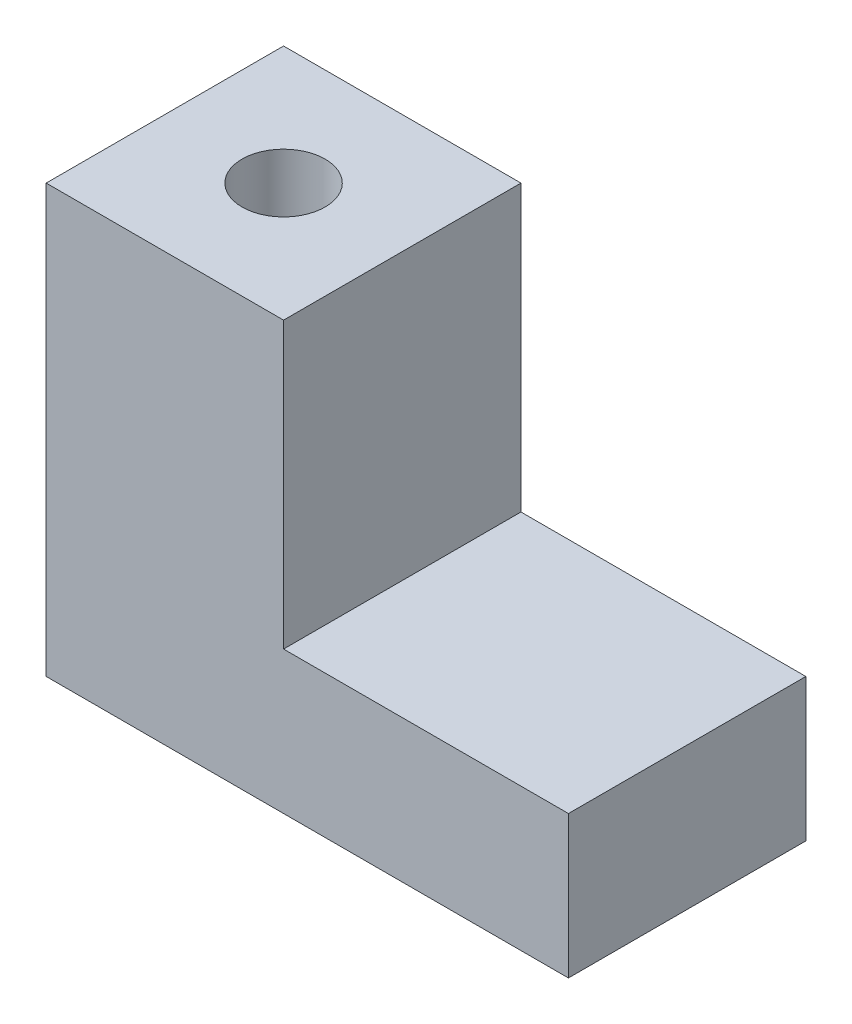
ISO-10303-21;
HEADER;
FILE_DESCRIPTION(('STEP AP214'),'2;1');
FILE_NAME('part.step','',(''),(''),'','','');
FILE_SCHEMA(('AUTOMOTIVE_DESIGN { 1 0 10303 214 1 1 1 1 }'));
ENDSEC;
DATA;
#1=APPLICATION_CONTEXT('core data for automotive mechanical design processes');
#2=APPLICATION_PROTOCOL_DEFINITION('international standard','automotive_design',2000,#1);
#3=PRODUCT_CONTEXT('',#1,'mechanical');
#4=PRODUCT('Part','Part','',(#3));
#5=PRODUCT_RELATED_PRODUCT_CATEGORY('part','',(#4));
#6=PRODUCT_DEFINITION_FORMATION('','',#4);
#7=PRODUCT_DEFINITION_CONTEXT('part definition',#1,'design');
#8=PRODUCT_DEFINITION('design','',#6,#7);
#9=PRODUCT_DEFINITION_SHAPE('','',#8);
#10=(LENGTH_UNIT() NAMED_UNIT(*) SI_UNIT(.MILLI.,.METRE.));
#11=(NAMED_UNIT(*) PLANE_ANGLE_UNIT() SI_UNIT($,.RADIAN.));
#12=(NAMED_UNIT(*) SI_UNIT($,.STERADIAN.) SOLID_ANGLE_UNIT());
#13=UNCERTAINTY_MEASURE_WITH_UNIT(LENGTH_MEASURE(1.E-05),#10,'distance_accuracy_value','');
#14=(GEOMETRIC_REPRESENTATION_CONTEXT(3) GLOBAL_UNCERTAINTY_ASSIGNED_CONTEXT((#13)) GLOBAL_UNIT_ASSIGNED_CONTEXT((#10,
#11,#12)) REPRESENTATION_CONTEXT('',''));
#15=CARTESIAN_POINT('',(0.,0.,0.));
#16=DIRECTION('',(0.,0.,1.));
#17=DIRECTION('',(1.,0.,0.));
#18=AXIS2_PLACEMENT_3D('',#15,#16,#17);
#19=CARTESIAN_POINT('',(5.,0.,-5.));
#20=DIRECTION('',(0.,1.,0.));
#21=DIRECTION('',(0.,0.,1.));
#22=AXIS2_PLACEMENT_3D('',#19,#20,#21);
#23=CYLINDRICAL_SURFACE('',#22,1.75);
#24=CARTESIAN_POINT('',(5.,18.,-5.));
#25=DIRECTION('',(0.,1.,0.));
#26=DIRECTION('',(0.,0.,1.));
#27=AXIS2_PLACEMENT_3D('',#24,#25,#26);
#28=CIRCLE('',#27,1.75);
#29=CARTESIAN_POINT('',(5.,18.,-3.25));
#30=VERTEX_POINT('',#29);
#31=EDGE_CURVE('E178',#30,#30,#28,.T.);
#32=ORIENTED_EDGE('',*,*,#31,.T.);
#33=EDGE_LOOP('',(#32));
#34=FACE_BOUND('',#33,.T.);
#35=CARTESIAN_POINT('',(5.,3.,-5.));
#36=DIRECTION('',(0.,-1.,0.));
#37=DIRECTION('',(0.,0.,-1.));
#38=AXIS2_PLACEMENT_3D('',#35,#36,#37);
#39=CIRCLE('',#38,1.75);
#40=CARTESIAN_POINT('',(5.,3.,-6.75));
#41=VERTEX_POINT('',#40);
#42=EDGE_CURVE('E37',#41,#41,#39,.F.);
#43=ORIENTED_EDGE('',*,*,#42,.F.);
#44=EDGE_LOOP('',(#43));
#45=FACE_BOUND('',#44,.T.);
#46=ADVANCED_FACE('F33',(#34,#45),#23,.F.);
#47=CARTESIAN_POINT('',(0.,6.,0.));
#48=DIRECTION('',(0.,-1.,0.));
#49=DIRECTION('',(0.,0.,-1.));
#50=AXIS2_PLACEMENT_3D('',#47,#48,#49);
#51=PLANE('',#50);
#52=DIRECTION('',(0.,0.,-1.));
#53=VECTOR('',#52,1.);
#54=CARTESIAN_POINT('',(10.,6.,-10.));
#55=LINE('',#54,#53);
#56=CARTESIAN_POINT('',(10.,6.,0.));
#57=VERTEX_POINT('',#56);
#58=CARTESIAN_POINT('',(10.,6.,-10.));
#59=VERTEX_POINT('',#58);
#60=EDGE_CURVE('E57',#57,#59,#55,.T.);
#61=ORIENTED_EDGE('',*,*,#60,.F.);
#62=DIRECTION('',(1.,0.,0.));
#63=VECTOR('',#62,1.);
#64=CARTESIAN_POINT('',(22.,6.,0.));
#65=LINE('',#64,#63);
#66=CARTESIAN_POINT('',(22.,6.,0.));
#67=VERTEX_POINT('',#66);
#68=EDGE_CURVE('E200',#57,#67,#65,.T.);
#69=ORIENTED_EDGE('',*,*,#68,.T.);
#70=DIRECTION('',(0.,0.,-1.));
#71=VECTOR('',#70,1.);
#72=CARTESIAN_POINT('',(22.,6.,-10.));
#73=LINE('',#72,#71);
#74=CARTESIAN_POINT('',(22.,6.,-10.));
#75=VERTEX_POINT('',#74);
#76=EDGE_CURVE('E202',#67,#75,#73,.T.);
#77=ORIENTED_EDGE('',*,*,#76,.T.);
#78=DIRECTION('',(-1.,0.,0.));
#79=VECTOR('',#78,1.);
#80=CARTESIAN_POINT('',(0.,6.,-10.));
#81=LINE('',#80,#79);
#82=EDGE_CURVE('E205',#75,#59,#81,.T.);
#83=ORIENTED_EDGE('',*,*,#82,.T.);
#84=EDGE_LOOP('',(#61,#69,#77,#83));
#85=FACE_BOUND('',#84,.T.);
#86=ADVANCED_FACE('F246',(#85),#51,.F.);
#87=CARTESIAN_POINT('',(0.,6.,0.));
#88=DIRECTION('',(1.,0.,0.));
#89=DIRECTION('',(0.,0.,-1.));
#90=AXIS2_PLACEMENT_3D('',#87,#88,#89);
#91=PLANE('',#90);
#92=DIRECTION('',(0.,0.,1.));
#93=VECTOR('',#92,1.);
#94=CARTESIAN_POINT('',(0.,0.,0.));
#95=LINE('',#94,#93);
#96=CARTESIAN_POINT('',(0.,0.,-10.));
#97=VERTEX_POINT('',#96);
#98=CARTESIAN_POINT('',(0.,0.,0.));
#99=VERTEX_POINT('',#98);
#100=EDGE_CURVE('E199',#97,#99,#95,.T.);
#101=ORIENTED_EDGE('',*,*,#100,.T.);
#102=DIRECTION('',(0.,-1.,0.));
#103=VECTOR('',#102,1.);
#104=CARTESIAN_POINT('',(0.,6.,0.));
#105=LINE('',#104,#103);
#106=CARTESIAN_POINT('',(0.,18.,0.));
#107=VERTEX_POINT('',#106);
#108=EDGE_CURVE('E11',#107,#99,#105,.T.);
#109=ORIENTED_EDGE('',*,*,#108,.F.);
#110=DIRECTION('',(0.,0.,1.));
#111=VECTOR('',#110,1.);
#112=CARTESIAN_POINT('',(0.,18.,-10.));
#113=LINE('',#112,#111);
#114=CARTESIAN_POINT('',(0.,18.,-10.));
#115=VERTEX_POINT('',#114);
#116=EDGE_CURVE('E187',#115,#107,#113,.T.);
#117=ORIENTED_EDGE('',*,*,#116,.F.);
#118=DIRECTION('',(0.,-1.,0.));
#119=VECTOR('',#118,1.);
#120=CARTESIAN_POINT('',(0.,6.,-10.));
#121=LINE('',#120,#119);
#122=EDGE_CURVE('E207',#115,#97,#121,.T.);
#123=ORIENTED_EDGE('',*,*,#122,.T.);
#124=EDGE_LOOP('',(#101,#109,#117,#123));
#125=FACE_BOUND('',#124,.T.);
#126=ADVANCED_FACE('F35',(#125),#91,.F.);
#127=CARTESIAN_POINT('',(22.,6.,0.));
#128=DIRECTION('',(0.,0.,-1.));
#129=DIRECTION('',(-1.,0.,0.));
#130=AXIS2_PLACEMENT_3D('',#127,#128,#129);
#131=PLANE('',#130);
#132=DIRECTION('',(1.,0.,0.));
#133=VECTOR('',#132,1.);
#134=CARTESIAN_POINT('',(22.,0.,0.));
#135=LINE('',#134,#133);
#136=CARTESIAN_POINT('',(22.,0.,0.));
#137=VERTEX_POINT('',#136);
#138=EDGE_CURVE('E210',#99,#137,#135,.T.);
#139=ORIENTED_EDGE('',*,*,#138,.T.);
#140=DIRECTION('',(0.,-1.,0.));
#141=VECTOR('',#140,1.);
#142=CARTESIAN_POINT('',(22.,6.,0.));
#143=LINE('',#142,#141);
#144=EDGE_CURVE('E42',#67,#137,#143,.T.);
#145=ORIENTED_EDGE('',*,*,#144,.F.);
#146=ORIENTED_EDGE('',*,*,#68,.F.);
#147=DIRECTION('',(0.,-1.,0.));
#148=VECTOR('',#147,1.);
#149=CARTESIAN_POINT('',(10.,18.,0.));
#150=LINE('',#149,#148);
#151=CARTESIAN_POINT('',(10.,18.,0.));
#152=VERTEX_POINT('',#151);
#153=EDGE_CURVE('E192',#152,#57,#150,.T.);
#154=ORIENTED_EDGE('',*,*,#153,.F.);
#155=DIRECTION('',(1.,0.,0.));
#156=VECTOR('',#155,1.);
#157=CARTESIAN_POINT('',(10.,18.,0.));
#158=LINE('',#157,#156);
#159=EDGE_CURVE('E190',#107,#152,#158,.T.);
#160=ORIENTED_EDGE('',*,*,#159,.F.);
#161=ORIENTED_EDGE('',*,*,#108,.T.);
#162=EDGE_LOOP('',(#139,#145,#146,#154,#160,#161));
#163=FACE_BOUND('',#162,.T.);
#164=ADVANCED_FACE('F241',(#163),#131,.F.);
#165=CARTESIAN_POINT('',(22.,6.,-10.));
#166=DIRECTION('',(-1.,0.,0.));
#167=DIRECTION('',(0.,0.,1.));
#168=AXIS2_PLACEMENT_3D('',#165,#166,#167);
#169=PLANE('',#168);
#170=DIRECTION('',(0.,0.,-1.));
#171=VECTOR('',#170,1.);
#172=CARTESIAN_POINT('',(22.,0.,-10.));
#173=LINE('',#172,#171);
#174=CARTESIAN_POINT('',(22.,0.,-10.));
#175=VERTEX_POINT('',#174);
#176=EDGE_CURVE('E212',#137,#175,#173,.T.);
#177=ORIENTED_EDGE('',*,*,#176,.T.);
#178=DIRECTION('',(0.,-1.,0.));
#179=VECTOR('',#178,1.);
#180=CARTESIAN_POINT('',(22.,6.,-10.));
#181=LINE('',#180,#179);
#182=EDGE_CURVE('E217',#75,#175,#181,.T.);
#183=ORIENTED_EDGE('',*,*,#182,.F.);
#184=ORIENTED_EDGE('',*,*,#76,.F.);
#185=ORIENTED_EDGE('',*,*,#144,.T.);
#186=EDGE_LOOP('',(#177,#183,#184,#185));
#187=FACE_BOUND('',#186,.T.);
#188=ADVANCED_FACE('F225',(#187),#169,.F.);
#189=CARTESIAN_POINT('',(0.,6.,-10.));
#190=DIRECTION('',(0.,0.,1.));
#191=DIRECTION('',(1.,0.,0.));
#192=AXIS2_PLACEMENT_3D('',#189,#190,#191);
#193=PLANE('',#192);
#194=DIRECTION('',(-1.,0.,0.));
#195=VECTOR('',#194,1.);
#196=CARTESIAN_POINT('',(0.,0.,-10.));
#197=LINE('',#196,#195);
#198=EDGE_CURVE('E203',#175,#97,#197,.T.);
#199=ORIENTED_EDGE('',*,*,#198,.T.);
#200=ORIENTED_EDGE('',*,*,#122,.F.);
#201=DIRECTION('',(-1.,0.,0.));
#202=VECTOR('',#201,1.);
#203=CARTESIAN_POINT('',(10.,18.,-10.));
#204=LINE('',#203,#202);
#205=CARTESIAN_POINT('',(10.,18.,-10.));
#206=VERTEX_POINT('',#205);
#207=EDGE_CURVE('E184',#206,#115,#204,.T.);
#208=ORIENTED_EDGE('',*,*,#207,.F.);
#209=DIRECTION('',(0.,-1.,0.));
#210=VECTOR('',#209,1.);
#211=CARTESIAN_POINT('',(10.,18.,-10.));
#212=LINE('',#211,#210);
#213=EDGE_CURVE('E196',#206,#59,#212,.T.);
#214=ORIENTED_EDGE('',*,*,#213,.T.);
#215=ORIENTED_EDGE('',*,*,#82,.F.);
#216=ORIENTED_EDGE('',*,*,#182,.T.);
#217=EDGE_LOOP('',(#199,#200,#208,#214,#215,#216));
#218=FACE_BOUND('',#217,.T.);
#219=ADVANCED_FACE('F233',(#218),#193,.F.);
#220=CARTESIAN_POINT('',(0.,0.,0.));
#221=DIRECTION('',(0.,-1.,0.));
#222=DIRECTION('',(0.,0.,-1.));
#223=AXIS2_PLACEMENT_3D('',#220,#221,#222);
#224=PLANE('',#223);
#225=DIRECTION('',(-0.5,0.,-0.866025403784439));
#226=VECTOR('',#225,1.);
#227=CARTESIAN_POINT('',(3.41228675972853,0.,-2.25));
#228=LINE('',#227,#226);
#229=CARTESIAN_POINT('',(3.41228675972853,0.,-2.25));
#230=VERTEX_POINT('',#229);
#231=CARTESIAN_POINT('',(1.82457351945706,0.,-5.));
#232=VERTEX_POINT('',#231);
#233=EDGE_CURVE('E49',#230,#232,#228,.T.);
#234=ORIENTED_EDGE('',*,*,#233,.F.);
#235=DIRECTION('',(-1.,0.,0.));
#236=VECTOR('',#235,1.);
#237=CARTESIAN_POINT('',(6.58771324027147,0.,-2.25));
#238=LINE('',#237,#236);
#239=CARTESIAN_POINT('',(6.58771324027147,0.,-2.25));
#240=VERTEX_POINT('',#239);
#241=EDGE_CURVE('E145',#240,#230,#238,.T.);
#242=ORIENTED_EDGE('',*,*,#241,.F.);
#243=DIRECTION('',(-0.5,0.,0.866025403784438));
#244=VECTOR('',#243,1.);
#245=CARTESIAN_POINT('',(8.17542648054294,0.,-5.));
#246=LINE('',#245,#244);
#247=CARTESIAN_POINT('',(8.17542648054294,0.,-5.));
#248=VERTEX_POINT('',#247);
#249=EDGE_CURVE('E148',#248,#240,#246,.T.);
#250=ORIENTED_EDGE('',*,*,#249,.F.);
#251=DIRECTION('',(0.5,0.,0.866025403784438));
#252=VECTOR('',#251,1.);
#253=CARTESIAN_POINT('',(6.58771324027147,0.,-7.75));
#254=LINE('',#253,#252);
#255=CARTESIAN_POINT('',(6.58771324027147,0.,-7.75));
#256=VERTEX_POINT('',#255);
#257=EDGE_CURVE('E164',#256,#248,#254,.T.);
#258=ORIENTED_EDGE('',*,*,#257,.F.);
#259=DIRECTION('',(1.,0.,0.));
#260=VECTOR('',#259,1.);
#261=CARTESIAN_POINT('',(3.41228675972853,0.,-7.75));
#262=LINE('',#261,#260);
#263=CARTESIAN_POINT('',(3.41228675972853,0.,-7.75));
#264=VERTEX_POINT('',#263);
#265=EDGE_CURVE('E161',#264,#256,#262,.T.);
#266=ORIENTED_EDGE('',*,*,#265,.F.);
#267=DIRECTION('',(0.5,0.,-0.866025403784438));
#268=VECTOR('',#267,1.);
#269=CARTESIAN_POINT('',(1.82457351945706,0.,-5.));
#270=LINE('',#269,#268);
#271=EDGE_CURVE('E159',#232,#264,#270,.T.);
#272=ORIENTED_EDGE('',*,*,#271,.F.);
#273=EDGE_LOOP('',(#234,#242,#250,#258,#266,#272));
#274=FACE_BOUND('',#273,.T.);
#275=ORIENTED_EDGE('',*,*,#100,.F.);
#276=ORIENTED_EDGE('',*,*,#198,.F.);
#277=ORIENTED_EDGE('',*,*,#176,.F.);
#278=ORIENTED_EDGE('',*,*,#138,.F.);
#279=EDGE_LOOP('',(#275,#276,#277,#278));
#280=FACE_BOUND('',#279,.T.);
#281=ADVANCED_FACE('F231',(#274,#280),#224,.T.);
#282=CARTESIAN_POINT('',(10.,18.,-10.));
#283=DIRECTION('',(-1.,0.,0.));
#284=DIRECTION('',(0.,0.,1.));
#285=AXIS2_PLACEMENT_3D('',#282,#283,#284);
#286=PLANE('',#285);
#287=ORIENTED_EDGE('',*,*,#60,.T.);
#288=ORIENTED_EDGE('',*,*,#213,.F.);
#289=DIRECTION('',(0.,0.,-1.));
#290=VECTOR('',#289,1.);
#291=CARTESIAN_POINT('',(10.,18.,-10.));
#292=LINE('',#291,#290);
#293=EDGE_CURVE('E181',#152,#206,#292,.T.);
#294=ORIENTED_EDGE('',*,*,#293,.F.);
#295=ORIENTED_EDGE('',*,*,#153,.T.);
#296=EDGE_LOOP('',(#287,#288,#294,#295));
#297=FACE_BOUND('',#296,.T.);
#298=ADVANCED_FACE('F245',(#297),#286,.F.);
#299=CARTESIAN_POINT('',(0.,18.,0.));
#300=DIRECTION('',(0.,-1.,0.));
#301=DIRECTION('',(0.,0.,-1.));
#302=AXIS2_PLACEMENT_3D('',#299,#300,#301);
#303=PLANE('',#302);
#304=ORIENTED_EDGE('',*,*,#31,.F.);
#305=EDGE_LOOP('',(#304));
#306=FACE_BOUND('',#305,.T.);
#307=ORIENTED_EDGE('',*,*,#293,.T.);
#308=ORIENTED_EDGE('',*,*,#207,.T.);
#309=ORIENTED_EDGE('',*,*,#116,.T.);
#310=ORIENTED_EDGE('',*,*,#159,.T.);
#311=EDGE_LOOP('',(#307,#308,#309,#310));
#312=FACE_BOUND('',#311,.T.);
#313=ADVANCED_FACE('F239',(#306,#312),#303,.F.);
#314=CARTESIAN_POINT('',(0.,3.,0.));
#315=DIRECTION('',(0.,-1.,0.));
#316=DIRECTION('',(0.,0.,-1.));
#317=AXIS2_PLACEMENT_3D('',#314,#315,#316);
#318=PLANE('',#317);
#319=DIRECTION('',(-0.5,0.,-0.866025403784439));
#320=VECTOR('',#319,1.);
#321=CARTESIAN_POINT('',(3.41228675972853,3.,-2.25));
#322=LINE('',#321,#320);
#323=CARTESIAN_POINT('',(3.41228675972853,3.,-2.25));
#324=VERTEX_POINT('',#323);
#325=CARTESIAN_POINT('',(1.82457351945706,3.,-5.));
#326=VERTEX_POINT('',#325);
#327=EDGE_CURVE('E125',#324,#326,#322,.T.);
#328=ORIENTED_EDGE('',*,*,#327,.T.);
#329=DIRECTION('',(0.5,0.,-0.866025403784438));
#330=VECTOR('',#329,1.);
#331=CARTESIAN_POINT('',(1.82457351945706,3.,-5.));
#332=LINE('',#331,#330);
#333=CARTESIAN_POINT('',(3.41228675972853,3.,-7.75));
#334=VERTEX_POINT('',#333);
#335=EDGE_CURVE('E134',#326,#334,#332,.T.);
#336=ORIENTED_EDGE('',*,*,#335,.T.);
#337=DIRECTION('',(1.,0.,0.));
#338=VECTOR('',#337,1.);
#339=CARTESIAN_POINT('',(3.41228675972853,3.,-7.75));
#340=LINE('',#339,#338);
#341=CARTESIAN_POINT('',(6.58771324027147,3.,-7.75));
#342=VERTEX_POINT('',#341);
#343=EDGE_CURVE('E139',#334,#342,#340,.T.);
#344=ORIENTED_EDGE('',*,*,#343,.T.);
#345=DIRECTION('',(0.5,0.,0.866025403784438));
#346=VECTOR('',#345,1.);
#347=CARTESIAN_POINT('',(6.58771324027147,3.,-7.75));
#348=LINE('',#347,#346);
#349=CARTESIAN_POINT('',(8.17542648054294,3.,-5.));
#350=VERTEX_POINT('',#349);
#351=EDGE_CURVE('E152',#342,#350,#348,.T.);
#352=ORIENTED_EDGE('',*,*,#351,.T.);
#353=DIRECTION('',(-0.5,0.,0.866025403784438));
#354=VECTOR('',#353,1.);
#355=CARTESIAN_POINT('',(8.17542648054294,3.,-5.));
#356=LINE('',#355,#354);
#357=CARTESIAN_POINT('',(6.58771324027147,3.,-2.25));
#358=VERTEX_POINT('',#357);
#359=EDGE_CURVE('E155',#350,#358,#356,.T.);
#360=ORIENTED_EDGE('',*,*,#359,.T.);
#361=DIRECTION('',(-1.,0.,0.));
#362=VECTOR('',#361,1.);
#363=CARTESIAN_POINT('',(6.58771324027147,3.,-2.25));
#364=LINE('',#363,#362);
#365=EDGE_CURVE('E131',#358,#324,#364,.T.);
#366=ORIENTED_EDGE('',*,*,#365,.T.);
#367=EDGE_LOOP('',(#328,#336,#344,#352,#360,#366));
#368=FACE_BOUND('',#367,.T.);
#369=ORIENTED_EDGE('',*,*,#42,.T.);
#370=EDGE_LOOP('',(#369));
#371=FACE_BOUND('',#370,.T.);
#372=ADVANCED_FACE('F141',(#368,#371),#318,.T.);
#373=CARTESIAN_POINT('',(3.41228675972853,3.,-2.25));
#374=DIRECTION('',(-0.866025403784439,0.,0.5));
#375=DIRECTION('',(0.5,0.,0.866025403784439));
#376=AXIS2_PLACEMENT_3D('',#373,#374,#375);
#377=PLANE('',#376);
#378=ORIENTED_EDGE('',*,*,#233,.T.);
#379=DIRECTION('',(0.,-1.,0.));
#380=VECTOR('',#379,1.);
#381=CARTESIAN_POINT('',(1.82457351945706,3.,-5.));
#382=LINE('',#381,#380);
#383=EDGE_CURVE('E121',#326,#232,#382,.T.);
#384=ORIENTED_EDGE('',*,*,#383,.F.);
#385=ORIENTED_EDGE('',*,*,#327,.F.);
#386=DIRECTION('',(0.,-1.,0.));
#387=VECTOR('',#386,1.);
#388=CARTESIAN_POINT('',(3.41228675972853,3.,-2.25));
#389=LINE('',#388,#387);
#390=EDGE_CURVE('E169',#324,#230,#389,.T.);
#391=ORIENTED_EDGE('',*,*,#390,.T.);
#392=EDGE_LOOP('',(#378,#384,#385,#391));
#393=FACE_BOUND('',#392,.T.);
#394=ADVANCED_FACE('F123',(#393),#377,.F.);
#395=CARTESIAN_POINT('',(6.58771324027147,3.,-2.25));
#396=DIRECTION('',(0.,0.,1.));
#397=DIRECTION('',(1.,0.,0.));
#398=AXIS2_PLACEMENT_3D('',#395,#396,#397);
#399=PLANE('',#398);
#400=ORIENTED_EDGE('',*,*,#241,.T.);
#401=ORIENTED_EDGE('',*,*,#390,.F.);
#402=ORIENTED_EDGE('',*,*,#365,.F.);
#403=DIRECTION('',(0.,-1.,0.));
#404=VECTOR('',#403,1.);
#405=CARTESIAN_POINT('',(6.58771324027147,3.,-2.25));
#406=LINE('',#405,#404);
#407=EDGE_CURVE('E171',#358,#240,#406,.T.);
#408=ORIENTED_EDGE('',*,*,#407,.T.);
#409=EDGE_LOOP('',(#400,#401,#402,#408));
#410=FACE_BOUND('',#409,.T.);
#411=ADVANCED_FACE('F305',(#410),#399,.F.);
#412=CARTESIAN_POINT('',(8.17542648054294,3.,-5.));
#413=DIRECTION('',(0.866025403784439,0.,0.5));
#414=DIRECTION('',(0.5,0.,-0.866025403784439));
#415=AXIS2_PLACEMENT_3D('',#412,#413,#414);
#416=PLANE('',#415);
#417=ORIENTED_EDGE('',*,*,#249,.T.);
#418=ORIENTED_EDGE('',*,*,#407,.F.);
#419=ORIENTED_EDGE('',*,*,#359,.F.);
#420=DIRECTION('',(0.,-1.,0.));
#421=VECTOR('',#420,1.);
#422=CARTESIAN_POINT('',(8.17542648054294,3.,-5.));
#423=LINE('',#422,#421);
#424=EDGE_CURVE('E173',#350,#248,#423,.T.);
#425=ORIENTED_EDGE('',*,*,#424,.T.);
#426=EDGE_LOOP('',(#417,#418,#419,#425));
#427=FACE_BOUND('',#426,.T.);
#428=ADVANCED_FACE('F312',(#427),#416,.F.);
#429=CARTESIAN_POINT('',(6.58771324027147,3.,-7.75));
#430=DIRECTION('',(0.866025403784439,0.,-0.5));
#431=DIRECTION('',(-0.5,0.,-0.866025403784439));
#432=AXIS2_PLACEMENT_3D('',#429,#430,#431);
#433=PLANE('',#432);
#434=ORIENTED_EDGE('',*,*,#257,.T.);
#435=ORIENTED_EDGE('',*,*,#424,.F.);
#436=ORIENTED_EDGE('',*,*,#351,.F.);
#437=DIRECTION('',(0.,-1.,0.));
#438=VECTOR('',#437,1.);
#439=CARTESIAN_POINT('',(6.58771324027147,3.,-7.75));
#440=LINE('',#439,#438);
#441=EDGE_CURVE('E175',#342,#256,#440,.T.);
#442=ORIENTED_EDGE('',*,*,#441,.T.);
#443=EDGE_LOOP('',(#434,#435,#436,#442));
#444=FACE_BOUND('',#443,.T.);
#445=ADVANCED_FACE('F320',(#444),#433,.F.);
#446=CARTESIAN_POINT('',(3.41228675972853,3.,-7.75));
#447=DIRECTION('',(0.,0.,-1.));
#448=DIRECTION('',(-1.,0.,0.));
#449=AXIS2_PLACEMENT_3D('',#446,#447,#448);
#450=PLANE('',#449);
#451=ORIENTED_EDGE('',*,*,#265,.T.);
#452=ORIENTED_EDGE('',*,*,#441,.F.);
#453=ORIENTED_EDGE('',*,*,#343,.F.);
#454=DIRECTION('',(0.,-1.,0.));
#455=VECTOR('',#454,1.);
#456=CARTESIAN_POINT('',(3.41228675972853,3.,-7.75));
#457=LINE('',#456,#455);
#458=EDGE_CURVE('E130',#334,#264,#457,.T.);
#459=ORIENTED_EDGE('',*,*,#458,.T.);
#460=EDGE_LOOP('',(#451,#452,#453,#459));
#461=FACE_BOUND('',#460,.T.);
#462=ADVANCED_FACE('F328',(#461),#450,.F.);
#463=CARTESIAN_POINT('',(1.82457351945706,3.,-5.));
#464=DIRECTION('',(-0.866025403784439,0.,-0.5));
#465=DIRECTION('',(-0.5,0.,0.866025403784439));
#466=AXIS2_PLACEMENT_3D('',#463,#464,#465);
#467=PLANE('',#466);
#468=ORIENTED_EDGE('',*,*,#271,.T.);
#469=ORIENTED_EDGE('',*,*,#458,.F.);
#470=ORIENTED_EDGE('',*,*,#335,.F.);
#471=ORIENTED_EDGE('',*,*,#383,.T.);
#472=EDGE_LOOP('',(#468,#469,#470,#471));
#473=FACE_BOUND('',#472,.T.);
#474=ADVANCED_FACE('F135',(#473),#467,.F.);
#475=CLOSED_SHELL('',(#46,#86,#126,#164,#188,#219,#281,#298,#313,#372,#394,#411,#428,#445,#462,#474));
#476=MANIFOLD_SOLID_BREP('B2',#475);
#477=ADVANCED_BREP_SHAPE_REPRESENTATION('',(#18,#476),#14);
#478=SHAPE_DEFINITION_REPRESENTATION(#9,#477);
ENDSEC;
END-ISO-10303-21;
